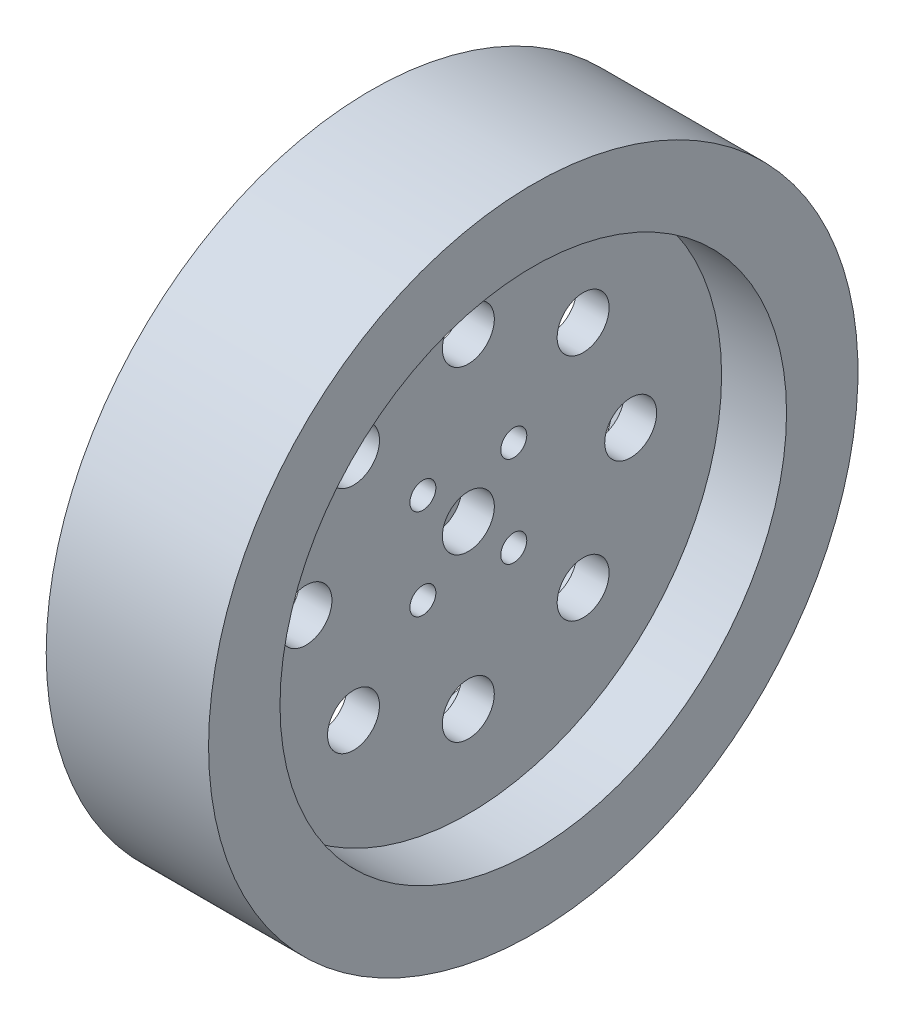
ISO-10303-21;
HEADER;
FILE_DESCRIPTION(('STEP AP214'),'2;1');
FILE_NAME('part.step','',(''),(''),'','','');
FILE_SCHEMA(('AUTOMOTIVE_DESIGN { 1 0 10303 214 1 1 1 1 }'));
ENDSEC;
DATA;
#1=APPLICATION_CONTEXT('core data for automotive mechanical design processes');
#2=APPLICATION_PROTOCOL_DEFINITION('international standard','automotive_design',2000,#1);
#3=PRODUCT_CONTEXT('',#1,'mechanical');
#4=PRODUCT('Part','Part','',(#3));
#5=PRODUCT_RELATED_PRODUCT_CATEGORY('part','',(#4));
#6=PRODUCT_DEFINITION_FORMATION('','',#4);
#7=PRODUCT_DEFINITION_CONTEXT('part definition',#1,'design');
#8=PRODUCT_DEFINITION('design','',#6,#7);
#9=PRODUCT_DEFINITION_SHAPE('','',#8);
#10=(LENGTH_UNIT() NAMED_UNIT(*) SI_UNIT(.MILLI.,.METRE.));
#11=(NAMED_UNIT(*) PLANE_ANGLE_UNIT() SI_UNIT($,.RADIAN.));
#12=(NAMED_UNIT(*) SI_UNIT($,.STERADIAN.) SOLID_ANGLE_UNIT());
#13=UNCERTAINTY_MEASURE_WITH_UNIT(LENGTH_MEASURE(1.E-05),#10,'distance_accuracy_value','');
#14=(GEOMETRIC_REPRESENTATION_CONTEXT(3) GLOBAL_UNCERTAINTY_ASSIGNED_CONTEXT((#13)) GLOBAL_UNIT_ASSIGNED_CONTEXT((#10,
#11,#12)) REPRESENTATION_CONTEXT('',''));
#15=CARTESIAN_POINT('',(0.,0.,0.));
#16=DIRECTION('',(0.,0.,1.));
#17=DIRECTION('',(1.,0.,0.));
#18=AXIS2_PLACEMENT_3D('',#15,#16,#17);
#19=CARTESIAN_POINT('',(12.5,0.,0.));
#20=DIRECTION('',(-1.,0.,0.));
#21=DIRECTION('',(0.,0.,-1.));
#22=AXIS2_PLACEMENT_3D('',#19,#20,#21);
#23=CYLINDRICAL_SURFACE('',#22,50.);
#24=CARTESIAN_POINT('',(12.5,0.,0.));
#25=DIRECTION('',(-1.,0.,0.));
#26=DIRECTION('',(0.,0.,1.));
#27=AXIS2_PLACEMENT_3D('',#24,#25,#26);
#28=CIRCLE('',#27,50.);
#29=CARTESIAN_POINT('',(12.5,0.,50.));
#30=VERTEX_POINT('',#29);
#31=EDGE_CURVE('E10',#30,#30,#28,.T.);
#32=ORIENTED_EDGE('',*,*,#31,.T.);
#33=EDGE_LOOP('',(#32));
#34=FACE_BOUND('',#33,.T.);
#35=CARTESIAN_POINT('',(-12.5,0.,0.));
#36=DIRECTION('',(-1.,0.,0.));
#37=DIRECTION('',(0.,0.,1.));
#38=AXIS2_PLACEMENT_3D('',#35,#36,#37);
#39=CIRCLE('',#38,50.);
#40=CARTESIAN_POINT('',(-12.5,0.,50.));
#41=VERTEX_POINT('',#40);
#42=EDGE_CURVE('E86',#41,#41,#39,.T.);
#43=ORIENTED_EDGE('',*,*,#42,.F.);
#44=EDGE_LOOP('',(#43));
#45=FACE_BOUND('',#44,.T.);
#46=ADVANCED_FACE('F33',(#34,#45),#23,.T.);
#47=CARTESIAN_POINT('',(12.5,0.,0.));
#48=DIRECTION('',(1.,0.,0.));
#49=DIRECTION('',(0.,0.,1.));
#50=AXIS2_PLACEMENT_3D('',#47,#48,#49);
#51=PLANE('',#50);
#52=CARTESIAN_POINT('',(12.5,0.,0.));
#53=DIRECTION('',(-1.,0.,0.));
#54=DIRECTION('',(0.,0.,1.));
#55=AXIS2_PLACEMENT_3D('',#52,#53,#54);
#56=CIRCLE('',#55,39.);
#57=CARTESIAN_POINT('',(12.5,0.,39.));
#58=VERTEX_POINT('',#57);
#59=EDGE_CURVE('E43',#58,#58,#56,.T.);
#60=ORIENTED_EDGE('',*,*,#59,.T.);
#61=EDGE_LOOP('',(#60));
#62=FACE_BOUND('',#61,.T.);
#63=ORIENTED_EDGE('',*,*,#31,.F.);
#64=EDGE_LOOP('',(#63));
#65=FACE_BOUND('',#64,.T.);
#66=ADVANCED_FACE('F161',(#62,#65),#51,.T.);
#67=CARTESIAN_POINT('',(2.5,0.,0.));
#68=DIRECTION('',(1.,0.,0.));
#69=DIRECTION('',(0.,0.,1.));
#70=AXIS2_PLACEMENT_3D('',#67,#68,#69);
#71=CYLINDRICAL_SURFACE('',#70,39.);
#72=CARTESIAN_POINT('',(2.5,0.,0.));
#73=DIRECTION('',(-1.,0.,0.));
#74=DIRECTION('',(0.,0.,1.));
#75=AXIS2_PLACEMENT_3D('',#72,#73,#74);
#76=CIRCLE('',#75,39.);
#77=CARTESIAN_POINT('',(2.5,0.,39.));
#78=VERTEX_POINT('',#77);
#79=EDGE_CURVE('E39',#78,#78,#76,.T.);
#80=ORIENTED_EDGE('',*,*,#79,.T.);
#81=EDGE_LOOP('',(#80));
#82=FACE_BOUND('',#81,.T.);
#83=ORIENTED_EDGE('',*,*,#59,.F.);
#84=EDGE_LOOP('',(#83));
#85=FACE_BOUND('',#84,.T.);
#86=ADVANCED_FACE('F165',(#82,#85),#71,.F.);
#87=CARTESIAN_POINT('',(2.5,0.,0.));
#88=DIRECTION('',(1.,0.,0.));
#89=DIRECTION('',(0.,0.,1.));
#90=AXIS2_PLACEMENT_3D('',#87,#88,#89);
#91=PLANE('',#90);
#92=CARTESIAN_POINT('',(2.5,-7.,7.));
#93=DIRECTION('',(-1.,0.,0.));
#94=DIRECTION('',(0.,0.,-1.));
#95=AXIS2_PLACEMENT_3D('',#92,#93,#94);
#96=CIRCLE('',#95,2.);
#97=CARTESIAN_POINT('',(2.5,-7.,5.));
#98=VERTEX_POINT('',#97);
#99=EDGE_CURVE('E82',#98,#98,#96,.T.);
#100=ORIENTED_EDGE('',*,*,#99,.T.);
#101=EDGE_LOOP('',(#100));
#102=FACE_BOUND('',#101,.T.);
#103=CARTESIAN_POINT('',(2.5,7.00000000000007,6.99999999999993));
#104=DIRECTION('',(-1.,0.,0.));
#105=DIRECTION('',(0.,-1.,0.));
#106=AXIS2_PLACEMENT_3D('',#103,#104,#105);
#107=CIRCLE('',#106,2.);
#108=CARTESIAN_POINT('',(2.5,5.00000000000007,6.99999999999995));
#109=VERTEX_POINT('',#108);
#110=EDGE_CURVE('E83',#109,#109,#107,.T.);
#111=ORIENTED_EDGE('',*,*,#110,.T.);
#112=EDGE_LOOP('',(#111));
#113=FACE_BOUND('',#112,.T.);
#114=CARTESIAN_POINT('',(2.5,-7.00000000000002,-6.99999999999998));
#115=DIRECTION('',(-1.,0.,0.));
#116=DIRECTION('',(0.,1.,0.));
#117=AXIS2_PLACEMENT_3D('',#114,#115,#116);
#118=CIRCLE('',#117,2.);
#119=CARTESIAN_POINT('',(2.5,-5.00000000000002,-6.99999999999998));
#120=VERTEX_POINT('',#119);
#121=EDGE_CURVE('E79',#120,#120,#118,.T.);
#122=ORIENTED_EDGE('',*,*,#121,.T.);
#123=EDGE_LOOP('',(#122));
#124=FACE_BOUND('',#123,.T.);
#125=CARTESIAN_POINT('',(2.5,7.,-7.));
#126=DIRECTION('',(-1.,0.,0.));
#127=DIRECTION('',(0.,0.,1.));
#128=AXIS2_PLACEMENT_3D('',#125,#126,#127);
#129=CIRCLE('',#128,2.);
#130=CARTESIAN_POINT('',(2.5,7.,-5.));
#131=VERTEX_POINT('',#130);
#132=EDGE_CURVE('E76',#131,#131,#129,.T.);
#133=ORIENTED_EDGE('',*,*,#132,.T.);
#134=EDGE_LOOP('',(#133));
#135=FACE_BOUND('',#134,.T.);
#136=CARTESIAN_POINT('',(2.5,0.,0.));
#137=DIRECTION('',(-1.,0.,0.));
#138=DIRECTION('',(0.,0.,1.));
#139=AXIS2_PLACEMENT_3D('',#136,#137,#138);
#140=CIRCLE('',#139,4.);
#141=CARTESIAN_POINT('',(2.5,0.,4.));
#142=VERTEX_POINT('',#141);
#143=EDGE_CURVE('E60',#142,#142,#140,.T.);
#144=ORIENTED_EDGE('',*,*,#143,.T.);
#145=EDGE_LOOP('',(#144));
#146=FACE_BOUND('',#145,.T.);
#147=CARTESIAN_POINT('',(2.5,0.,-25.));
#148=DIRECTION('',(-1.,0.,0.));
#149=DIRECTION('',(0.,1.,0.));
#150=AXIS2_PLACEMENT_3D('',#147,#148,#149);
#151=CIRCLE('',#150,4.);
#152=CARTESIAN_POINT('',(2.5,3.99999999999991,-25.));
#153=VERTEX_POINT('',#152);
#154=EDGE_CURVE('E55',#153,#153,#151,.T.);
#155=ORIENTED_EDGE('',*,*,#154,.T.);
#156=EDGE_LOOP('',(#155));
#157=FACE_BOUND('',#156,.T.);
#158=CARTESIAN_POINT('',(2.5,-17.6776695296638,-17.6776695296636));
#159=DIRECTION('',(-1.,0.,0.));
#160=DIRECTION('',(0.,0.707106781186544,-0.707106781186551));
#161=AXIS2_PLACEMENT_3D('',#158,#159,#160);
#162=CIRCLE('',#161,4.);
#163=CARTESIAN_POINT('',(2.5,-14.8492424049176,-20.5060966544098));
#164=VERTEX_POINT('',#163);
#165=EDGE_CURVE('E69',#164,#164,#162,.T.);
#166=ORIENTED_EDGE('',*,*,#165,.T.);
#167=EDGE_LOOP('',(#166));
#168=FACE_BOUND('',#167,.T.);
#169=CARTESIAN_POINT('',(2.5,-25.,0.));
#170=DIRECTION('',(-1.,0.,0.));
#171=DIRECTION('',(0.,0.,-1.));
#172=AXIS2_PLACEMENT_3D('',#169,#170,#171);
#173=CIRCLE('',#172,4.);
#174=CARTESIAN_POINT('',(2.5,-25.,-4.));
#175=VERTEX_POINT('',#174);
#176=EDGE_CURVE('E66',#175,#175,#173,.T.);
#177=ORIENTED_EDGE('',*,*,#176,.T.);
#178=EDGE_LOOP('',(#177));
#179=FACE_BOUND('',#178,.T.);
#180=CARTESIAN_POINT('',(2.5,-17.6776695296635,17.6776695296638));
#181=DIRECTION('',(-1.,0.,0.));
#182=DIRECTION('',(0.,-0.707106781186554,-0.707106781186541));
#183=AXIS2_PLACEMENT_3D('',#180,#181,#182);
#184=CIRCLE('',#183,4.);
#185=CARTESIAN_POINT('',(2.5,-20.5060966544097,14.8492424049177));
#186=VERTEX_POINT('',#185);
#187=EDGE_CURVE('E63',#186,#186,#184,.T.);
#188=ORIENTED_EDGE('',*,*,#187,.T.);
#189=EDGE_LOOP('',(#188));
#190=FACE_BOUND('',#189,.T.);
#191=CARTESIAN_POINT('',(2.5,2.61861100413235E-13,25.));
#192=DIRECTION('',(-1.,0.,0.));
#193=DIRECTION('',(0.,-1.,0.));
#194=AXIS2_PLACEMENT_3D('',#191,#192,#193);
#195=CIRCLE('',#194,4.);
#196=CARTESIAN_POINT('',(2.5,-3.99999999999974,25.));
#197=VERTEX_POINT('',#196);
#198=EDGE_CURVE('E59',#197,#197,#195,.T.);
#199=ORIENTED_EDGE('',*,*,#198,.T.);
#200=EDGE_LOOP('',(#199));
#201=FACE_BOUND('',#200,.T.);
#202=CARTESIAN_POINT('',(2.5,17.6776695296639,17.6776695296635));
#203=DIRECTION('',(-1.,0.,0.));
#204=DIRECTION('',(0.,-0.707106781186539,0.707106781186556));
#205=AXIS2_PLACEMENT_3D('',#202,#203,#204);
#206=CIRCLE('',#205,4.);
#207=CARTESIAN_POINT('',(2.5,14.8492424049177,20.5060966544097));
#208=VERTEX_POINT('',#207);
#209=EDGE_CURVE('E56',#208,#208,#206,.T.);
#210=ORIENTED_EDGE('',*,*,#209,.T.);
#211=EDGE_LOOP('',(#210));
#212=FACE_BOUND('',#211,.T.);
#213=CARTESIAN_POINT('',(2.5,17.6776695296637,-17.6776695296637));
#214=DIRECTION('',(-1.,0.,0.));
#215=DIRECTION('',(0.,0.707106781186549,0.707106781186546));
#216=AXIS2_PLACEMENT_3D('',#213,#214,#215);
#217=CIRCLE('',#216,4.);
#218=CARTESIAN_POINT('',(2.5,20.5060966544099,-14.8492424049175));
#219=VERTEX_POINT('',#218);
#220=EDGE_CURVE('E52',#219,#219,#217,.T.);
#221=ORIENTED_EDGE('',*,*,#220,.T.);
#222=EDGE_LOOP('',(#221));
#223=FACE_BOUND('',#222,.T.);
#224=CARTESIAN_POINT('',(2.5,25.,0.));
#225=DIRECTION('',(-1.,0.,0.));
#226=DIRECTION('',(0.,0.,1.));
#227=AXIS2_PLACEMENT_3D('',#224,#225,#226);
#228=CIRCLE('',#227,4.);
#229=CARTESIAN_POINT('',(2.5,25.,4.));
#230=VERTEX_POINT('',#229);
#231=EDGE_CURVE('E48',#230,#230,#228,.T.);
#232=ORIENTED_EDGE('',*,*,#231,.T.);
#233=EDGE_LOOP('',(#232));
#234=FACE_BOUND('',#233,.T.);
#235=ORIENTED_EDGE('',*,*,#79,.F.);
#236=EDGE_LOOP('',(#235));
#237=FACE_BOUND('',#236,.T.);
#238=ADVANCED_FACE('F232',(#102,#113,#124,#135,#146,#157,#168,#179,#190,#201,#212,#223,#234,
#237),#91,.T.);
#239=CARTESIAN_POINT('',(0.,25.,0.));
#240=DIRECTION('',(1.,0.,0.));
#241=DIRECTION('',(0.,0.,1.));
#242=AXIS2_PLACEMENT_3D('',#239,#240,#241);
#243=CYLINDRICAL_SURFACE('',#242,4.);
#244=ORIENTED_EDGE('',*,*,#231,.F.);
#245=EDGE_LOOP('',(#244));
#246=FACE_BOUND('',#245,.T.);
#247=CARTESIAN_POINT('',(-2.5,25.,0.));
#248=DIRECTION('',(-1.,0.,0.));
#249=DIRECTION('',(0.,0.,1.));
#250=AXIS2_PLACEMENT_3D('',#247,#248,#249);
#251=CIRCLE('',#250,4.);
#252=CARTESIAN_POINT('',(-2.5,25.,4.));
#253=VERTEX_POINT('',#252);
#254=EDGE_CURVE('E95',#253,#253,#251,.T.);
#255=ORIENTED_EDGE('',*,*,#254,.T.);
#256=EDGE_LOOP('',(#255));
#257=FACE_BOUND('',#256,.T.);
#258=ADVANCED_FACE('F228',(#246,#257),#243,.F.);
#259=CARTESIAN_POINT('',(0.,17.6776695296637,-17.6776695296637));
#260=DIRECTION('',(1.,0.,0.));
#261=DIRECTION('',(0.,0.,1.));
#262=AXIS2_PLACEMENT_3D('',#259,#260,#261);
#263=CYLINDRICAL_SURFACE('',#262,4.);
#264=ORIENTED_EDGE('',*,*,#220,.F.);
#265=EDGE_LOOP('',(#264));
#266=FACE_BOUND('',#265,.T.);
#267=CARTESIAN_POINT('',(-2.5,17.6776695296637,-17.6776695296637));
#268=DIRECTION('',(-1.,0.,0.));
#269=DIRECTION('',(0.,0.707106781186549,0.707106781186546));
#270=AXIS2_PLACEMENT_3D('',#267,#268,#269);
#271=CIRCLE('',#270,4.);
#272=CARTESIAN_POINT('',(-2.5,20.5060966544099,-14.8492424049175));
#273=VERTEX_POINT('',#272);
#274=EDGE_CURVE('E100',#273,#273,#271,.T.);
#275=ORIENTED_EDGE('',*,*,#274,.T.);
#276=EDGE_LOOP('',(#275));
#277=FACE_BOUND('',#276,.T.);
#278=ADVANCED_FACE('F224',(#266,#277),#263,.F.);
#279=CARTESIAN_POINT('',(0.,17.6776695296639,17.6776695296635));
#280=DIRECTION('',(1.,0.,0.));
#281=DIRECTION('',(0.,0.,1.));
#282=AXIS2_PLACEMENT_3D('',#279,#280,#281);
#283=CYLINDRICAL_SURFACE('',#282,4.);
#284=ORIENTED_EDGE('',*,*,#209,.F.);
#285=EDGE_LOOP('',(#284));
#286=FACE_BOUND('',#285,.T.);
#287=CARTESIAN_POINT('',(-2.5,17.6776695296639,17.6776695296635));
#288=DIRECTION('',(-1.,0.,0.));
#289=DIRECTION('',(0.,-0.707106781186539,0.707106781186556));
#290=AXIS2_PLACEMENT_3D('',#287,#288,#289);
#291=CIRCLE('',#290,4.);
#292=CARTESIAN_POINT('',(-2.5,14.8492424049177,20.5060966544097));
#293=VERTEX_POINT('',#292);
#294=EDGE_CURVE('E101',#293,#293,#291,.T.);
#295=ORIENTED_EDGE('',*,*,#294,.T.);
#296=EDGE_LOOP('',(#295));
#297=FACE_BOUND('',#296,.T.);
#298=ADVANCED_FACE('F220',(#286,#297),#283,.F.);
#299=CARTESIAN_POINT('',(0.,2.61861100413235E-13,25.));
#300=DIRECTION('',(1.,0.,0.));
#301=DIRECTION('',(0.,0.,1.));
#302=AXIS2_PLACEMENT_3D('',#299,#300,#301);
#303=CYLINDRICAL_SURFACE('',#302,4.);
#304=ORIENTED_EDGE('',*,*,#198,.F.);
#305=EDGE_LOOP('',(#304));
#306=FACE_BOUND('',#305,.T.);
#307=CARTESIAN_POINT('',(-2.5,2.61861100413235E-13,25.));
#308=DIRECTION('',(-1.,0.,0.));
#309=DIRECTION('',(0.,-1.,0.));
#310=AXIS2_PLACEMENT_3D('',#307,#308,#309);
#311=CIRCLE('',#310,4.);
#312=CARTESIAN_POINT('',(-2.5,-3.99999999999974,25.));
#313=VERTEX_POINT('',#312);
#314=EDGE_CURVE('E104',#313,#313,#311,.T.);
#315=ORIENTED_EDGE('',*,*,#314,.T.);
#316=EDGE_LOOP('',(#315));
#317=FACE_BOUND('',#316,.T.);
#318=ADVANCED_FACE('F216',(#306,#317),#303,.F.);
#319=CARTESIAN_POINT('',(0.,-17.6776695296635,17.6776695296638));
#320=DIRECTION('',(1.,0.,0.));
#321=DIRECTION('',(0.,0.,1.));
#322=AXIS2_PLACEMENT_3D('',#319,#320,#321);
#323=CYLINDRICAL_SURFACE('',#322,4.);
#324=ORIENTED_EDGE('',*,*,#187,.F.);
#325=EDGE_LOOP('',(#324));
#326=FACE_BOUND('',#325,.T.);
#327=CARTESIAN_POINT('',(-2.5,-17.6776695296635,17.6776695296638));
#328=DIRECTION('',(-1.,0.,0.));
#329=DIRECTION('',(0.,-0.707106781186554,-0.707106781186541));
#330=AXIS2_PLACEMENT_3D('',#327,#328,#329);
#331=CIRCLE('',#330,4.);
#332=CARTESIAN_POINT('',(-2.5,-20.5060966544097,14.8492424049177));
#333=VERTEX_POINT('',#332);
#334=EDGE_CURVE('E108',#333,#333,#331,.T.);
#335=ORIENTED_EDGE('',*,*,#334,.T.);
#336=EDGE_LOOP('',(#335));
#337=FACE_BOUND('',#336,.T.);
#338=ADVANCED_FACE('F212',(#326,#337),#323,.F.);
#339=CARTESIAN_POINT('',(0.,-25.,0.));
#340=DIRECTION('',(1.,0.,0.));
#341=DIRECTION('',(0.,0.,1.));
#342=AXIS2_PLACEMENT_3D('',#339,#340,#341);
#343=CYLINDRICAL_SURFACE('',#342,4.);
#344=ORIENTED_EDGE('',*,*,#176,.F.);
#345=EDGE_LOOP('',(#344));
#346=FACE_BOUND('',#345,.T.);
#347=CARTESIAN_POINT('',(-2.5,-25.,0.));
#348=DIRECTION('',(-1.,0.,0.));
#349=DIRECTION('',(0.,0.,-1.));
#350=AXIS2_PLACEMENT_3D('',#347,#348,#349);
#351=CIRCLE('',#350,4.);
#352=CARTESIAN_POINT('',(-2.5,-25.,-4.));
#353=VERTEX_POINT('',#352);
#354=EDGE_CURVE('E111',#353,#353,#351,.T.);
#355=ORIENTED_EDGE('',*,*,#354,.T.);
#356=EDGE_LOOP('',(#355));
#357=FACE_BOUND('',#356,.T.);
#358=ADVANCED_FACE('F208',(#346,#357),#343,.F.);
#359=CARTESIAN_POINT('',(0.,-17.6776695296638,-17.6776695296636));
#360=DIRECTION('',(1.,0.,0.));
#361=DIRECTION('',(0.,0.,1.));
#362=AXIS2_PLACEMENT_3D('',#359,#360,#361);
#363=CYLINDRICAL_SURFACE('',#362,4.);
#364=ORIENTED_EDGE('',*,*,#165,.F.);
#365=EDGE_LOOP('',(#364));
#366=FACE_BOUND('',#365,.T.);
#367=CARTESIAN_POINT('',(-2.5,-17.6776695296638,-17.6776695296636));
#368=DIRECTION('',(-1.,0.,0.));
#369=DIRECTION('',(0.,0.707106781186544,-0.707106781186551));
#370=AXIS2_PLACEMENT_3D('',#367,#368,#369);
#371=CIRCLE('',#370,4.);
#372=CARTESIAN_POINT('',(-2.5,-14.8492424049176,-20.5060966544098));
#373=VERTEX_POINT('',#372);
#374=EDGE_CURVE('E114',#373,#373,#371,.T.);
#375=ORIENTED_EDGE('',*,*,#374,.T.);
#376=EDGE_LOOP('',(#375));
#377=FACE_BOUND('',#376,.T.);
#378=ADVANCED_FACE('F204',(#366,#377),#363,.F.);
#379=CARTESIAN_POINT('',(0.,0.,-25.));
#380=DIRECTION('',(1.,0.,0.));
#381=DIRECTION('',(0.,0.,1.));
#382=AXIS2_PLACEMENT_3D('',#379,#380,#381);
#383=CYLINDRICAL_SURFACE('',#382,4.);
#384=ORIENTED_EDGE('',*,*,#154,.F.);
#385=EDGE_LOOP('',(#384));
#386=FACE_BOUND('',#385,.T.);
#387=CARTESIAN_POINT('',(-2.5,0.,-25.));
#388=DIRECTION('',(-1.,0.,0.));
#389=DIRECTION('',(0.,1.,0.));
#390=AXIS2_PLACEMENT_3D('',#387,#388,#389);
#391=CIRCLE('',#390,4.);
#392=CARTESIAN_POINT('',(-2.5,3.99999999999991,-25.));
#393=VERTEX_POINT('',#392);
#394=EDGE_CURVE('E117',#393,#393,#391,.T.);
#395=ORIENTED_EDGE('',*,*,#394,.T.);
#396=EDGE_LOOP('',(#395));
#397=FACE_BOUND('',#396,.T.);
#398=ADVANCED_FACE('F200',(#386,#397),#383,.F.);
#399=CARTESIAN_POINT('',(0.,0.,0.));
#400=DIRECTION('',(1.,0.,0.));
#401=DIRECTION('',(0.,0.,1.));
#402=AXIS2_PLACEMENT_3D('',#399,#400,#401);
#403=CYLINDRICAL_SURFACE('',#402,4.);
#404=ORIENTED_EDGE('',*,*,#143,.F.);
#405=EDGE_LOOP('',(#404));
#406=FACE_BOUND('',#405,.T.);
#407=CARTESIAN_POINT('',(-2.5,0.,0.));
#408=DIRECTION('',(-1.,0.,0.));
#409=DIRECTION('',(0.,0.,1.));
#410=AXIS2_PLACEMENT_3D('',#407,#408,#409);
#411=CIRCLE('',#410,4.);
#412=CARTESIAN_POINT('',(-2.5,0.,4.));
#413=VERTEX_POINT('',#412);
#414=EDGE_CURVE('E105',#413,#413,#411,.T.);
#415=ORIENTED_EDGE('',*,*,#414,.T.);
#416=EDGE_LOOP('',(#415));
#417=FACE_BOUND('',#416,.T.);
#418=ADVANCED_FACE('F196',(#406,#417),#403,.F.);
#419=CARTESIAN_POINT('',(0.,7.,-7.));
#420=DIRECTION('',(1.,0.,0.));
#421=DIRECTION('',(0.,0.,1.));
#422=AXIS2_PLACEMENT_3D('',#419,#420,#421);
#423=CYLINDRICAL_SURFACE('',#422,2.);
#424=ORIENTED_EDGE('',*,*,#132,.F.);
#425=EDGE_LOOP('',(#424));
#426=FACE_BOUND('',#425,.T.);
#427=CARTESIAN_POINT('',(-2.5,7.,-7.));
#428=DIRECTION('',(-1.,0.,0.));
#429=DIRECTION('',(0.,0.,1.));
#430=AXIS2_PLACEMENT_3D('',#427,#428,#429);
#431=CIRCLE('',#430,2.);
#432=CARTESIAN_POINT('',(-2.5,7.,-5.));
#433=VERTEX_POINT('',#432);
#434=EDGE_CURVE('E124',#433,#433,#431,.T.);
#435=ORIENTED_EDGE('',*,*,#434,.T.);
#436=EDGE_LOOP('',(#435));
#437=FACE_BOUND('',#436,.T.);
#438=ADVANCED_FACE('F192',(#426,#437),#423,.F.);
#439=CARTESIAN_POINT('',(0.,-7.00000000000002,-6.99999999999998));
#440=DIRECTION('',(1.,0.,0.));
#441=DIRECTION('',(0.,0.,1.));
#442=AXIS2_PLACEMENT_3D('',#439,#440,#441);
#443=CYLINDRICAL_SURFACE('',#442,2.);
#444=ORIENTED_EDGE('',*,*,#121,.F.);
#445=EDGE_LOOP('',(#444));
#446=FACE_BOUND('',#445,.T.);
#447=CARTESIAN_POINT('',(-2.5,-7.00000000000002,-6.99999999999998));
#448=DIRECTION('',(-1.,0.,0.));
#449=DIRECTION('',(0.,1.,0.));
#450=AXIS2_PLACEMENT_3D('',#447,#448,#449);
#451=CIRCLE('',#450,2.);
#452=CARTESIAN_POINT('',(-2.5,-5.00000000000002,-6.99999999999998));
#453=VERTEX_POINT('',#452);
#454=EDGE_CURVE('E127',#453,#453,#451,.T.);
#455=ORIENTED_EDGE('',*,*,#454,.T.);
#456=EDGE_LOOP('',(#455));
#457=FACE_BOUND('',#456,.T.);
#458=ADVANCED_FACE('F188',(#446,#457),#443,.F.);
#459=CARTESIAN_POINT('',(0.,7.00000000000007,6.99999999999993));
#460=DIRECTION('',(1.,0.,0.));
#461=DIRECTION('',(0.,0.,1.));
#462=AXIS2_PLACEMENT_3D('',#459,#460,#461);
#463=CYLINDRICAL_SURFACE('',#462,2.);
#464=ORIENTED_EDGE('',*,*,#110,.F.);
#465=EDGE_LOOP('',(#464));
#466=FACE_BOUND('',#465,.T.);
#467=CARTESIAN_POINT('',(-2.5,7.00000000000007,6.99999999999993));
#468=DIRECTION('',(-1.,0.,0.));
#469=DIRECTION('',(0.,-1.,0.));
#470=AXIS2_PLACEMENT_3D('',#467,#468,#469);
#471=CIRCLE('',#470,2.);
#472=CARTESIAN_POINT('',(-2.5,5.00000000000007,6.99999999999995));
#473=VERTEX_POINT('',#472);
#474=EDGE_CURVE('E128',#473,#473,#471,.T.);
#475=ORIENTED_EDGE('',*,*,#474,.T.);
#476=EDGE_LOOP('',(#475));
#477=FACE_BOUND('',#476,.T.);
#478=ADVANCED_FACE('F181',(#466,#477),#463,.F.);
#479=CARTESIAN_POINT('',(0.,-7.,7.));
#480=DIRECTION('',(1.,0.,0.));
#481=DIRECTION('',(0.,0.,1.));
#482=AXIS2_PLACEMENT_3D('',#479,#480,#481);
#483=CYLINDRICAL_SURFACE('',#482,2.);
#484=ORIENTED_EDGE('',*,*,#99,.F.);
#485=EDGE_LOOP('',(#484));
#486=FACE_BOUND('',#485,.T.);
#487=CARTESIAN_POINT('',(-2.5,-7.,7.));
#488=DIRECTION('',(-1.,0.,0.));
#489=DIRECTION('',(0.,0.,-1.));
#490=AXIS2_PLACEMENT_3D('',#487,#488,#489);
#491=CIRCLE('',#490,2.);
#492=CARTESIAN_POINT('',(-2.5,-7.,5.));
#493=VERTEX_POINT('',#492);
#494=EDGE_CURVE('E131',#493,#493,#491,.T.);
#495=ORIENTED_EDGE('',*,*,#494,.T.);
#496=EDGE_LOOP('',(#495));
#497=FACE_BOUND('',#496,.T.);
#498=ADVANCED_FACE('F172',(#486,#497),#483,.F.);
#499=CARTESIAN_POINT('',(-12.5,0.,0.));
#500=DIRECTION('',(-1.,0.,0.));
#501=DIRECTION('',(0.,0.,1.));
#502=AXIS2_PLACEMENT_3D('',#499,#500,#501);
#503=PLANE('',#502);
#504=CARTESIAN_POINT('',(-12.5,0.,0.));
#505=DIRECTION('',(-1.,0.,0.));
#506=DIRECTION('',(0.,0.,1.));
#507=AXIS2_PLACEMENT_3D('',#504,#505,#506);
#508=CIRCLE('',#507,39.);
#509=CARTESIAN_POINT('',(-12.5,0.,39.));
#510=VERTEX_POINT('',#509);
#511=EDGE_CURVE('E92',#510,#510,#508,.T.);
#512=ORIENTED_EDGE('',*,*,#511,.F.);
#513=EDGE_LOOP('',(#512));
#514=FACE_BOUND('',#513,.T.);
#515=ORIENTED_EDGE('',*,*,#42,.T.);
#516=EDGE_LOOP('',(#515));
#517=FACE_BOUND('',#516,.T.);
#518=ADVANCED_FACE('F170',(#514,#517),#503,.T.);
#519=CARTESIAN_POINT('',(-2.5,0.,0.));
#520=DIRECTION('',(-1.,0.,0.));
#521=DIRECTION('',(0.,0.,-1.));
#522=AXIS2_PLACEMENT_3D('',#519,#520,#521);
#523=CYLINDRICAL_SURFACE('',#522,39.);
#524=CARTESIAN_POINT('',(-2.5,0.,0.));
#525=DIRECTION('',(-1.,0.,0.));
#526=DIRECTION('',(0.,0.,1.));
#527=AXIS2_PLACEMENT_3D('',#524,#525,#526);
#528=CIRCLE('',#527,39.);
#529=CARTESIAN_POINT('',(-2.5,0.,39.));
#530=VERTEX_POINT('',#529);
#531=EDGE_CURVE('E91',#530,#530,#528,.T.);
#532=ORIENTED_EDGE('',*,*,#531,.F.);
#533=EDGE_LOOP('',(#532));
#534=FACE_BOUND('',#533,.T.);
#535=ORIENTED_EDGE('',*,*,#511,.T.);
#536=EDGE_LOOP('',(#535));
#537=FACE_BOUND('',#536,.T.);
#538=ADVANCED_FACE('F156',(#534,#537),#523,.F.);
#539=CARTESIAN_POINT('',(-2.5,0.,0.));
#540=DIRECTION('',(-1.,0.,0.));
#541=DIRECTION('',(0.,0.,1.));
#542=AXIS2_PLACEMENT_3D('',#539,#540,#541);
#543=PLANE('',#542);
#544=CARTESIAN_POINT('',(-2.5,0.,0.));
#545=DIRECTION('',(1.,0.,0.));
#546=DIRECTION('',(0.,0.,-1.));
#547=AXIS2_PLACEMENT_3D('',#544,#545,#546);
#548=CIRCLE('',#547,12.5);
#549=CARTESIAN_POINT('',(-2.5,0.,-12.5));
#550=VERTEX_POINT('',#549);
#551=EDGE_CURVE('E137',#550,#550,#548,.T.);
#552=ORIENTED_EDGE('',*,*,#551,.T.);
#553=EDGE_LOOP('',(#552));
#554=FACE_BOUND('',#553,.T.);
#555=ORIENTED_EDGE('',*,*,#274,.F.);
#556=EDGE_LOOP('',(#555));
#557=FACE_BOUND('',#556,.T.);
#558=ORIENTED_EDGE('',*,*,#394,.F.);
#559=EDGE_LOOP('',(#558));
#560=FACE_BOUND('',#559,.T.);
#561=ORIENTED_EDGE('',*,*,#374,.F.);
#562=EDGE_LOOP('',(#561));
#563=FACE_BOUND('',#562,.T.);
#564=ORIENTED_EDGE('',*,*,#354,.F.);
#565=EDGE_LOOP('',(#564));
#566=FACE_BOUND('',#565,.T.);
#567=ORIENTED_EDGE('',*,*,#334,.F.);
#568=EDGE_LOOP('',(#567));
#569=FACE_BOUND('',#568,.T.);
#570=ORIENTED_EDGE('',*,*,#314,.F.);
#571=EDGE_LOOP('',(#570));
#572=FACE_BOUND('',#571,.T.);
#573=ORIENTED_EDGE('',*,*,#294,.F.);
#574=EDGE_LOOP('',(#573));
#575=FACE_BOUND('',#574,.T.);
#576=ORIENTED_EDGE('',*,*,#254,.F.);
#577=EDGE_LOOP('',(#576));
#578=FACE_BOUND('',#577,.T.);
#579=ORIENTED_EDGE('',*,*,#531,.T.);
#580=EDGE_LOOP('',(#579));
#581=FACE_BOUND('',#580,.T.);
#582=ADVANCED_FACE('F148',(#554,#557,#560,#563,#566,#569,#572,#575,#578,#581),#543,.T.);
#583=CARTESIAN_POINT('',(-10.5,0.,0.));
#584=DIRECTION('',(-1.,0.,0.));
#585=DIRECTION('',(0.,0.,-1.));
#586=AXIS2_PLACEMENT_3D('',#583,#584,#585);
#587=PLANE('',#586);
#588=CARTESIAN_POINT('',(-10.5,0.,0.));
#589=DIRECTION('',(1.,0.,0.));
#590=DIRECTION('',(0.,0.,-1.));
#591=AXIS2_PLACEMENT_3D('',#588,#589,#590);
#592=CIRCLE('',#591,12.5);
#593=CARTESIAN_POINT('',(-10.5,0.,-12.5));
#594=VERTEX_POINT('',#593);
#595=EDGE_CURVE('E132',#594,#594,#592,.T.);
#596=ORIENTED_EDGE('',*,*,#595,.F.);
#597=EDGE_LOOP('',(#596));
#598=FACE_BOUND('',#597,.T.);
#599=ADVANCED_FACE('F146',(#598),#587,.T.);
#600=CARTESIAN_POINT('',(-10.5,0.,0.));
#601=DIRECTION('',(1.,0.,0.));
#602=DIRECTION('',(0.,0.,1.));
#603=AXIS2_PLACEMENT_3D('',#600,#601,#602);
#604=CYLINDRICAL_SURFACE('',#603,12.5);
#605=ORIENTED_EDGE('',*,*,#595,.T.);
#606=EDGE_LOOP('',(#605));
#607=FACE_BOUND('',#606,.T.);
#608=ORIENTED_EDGE('',*,*,#551,.F.);
#609=EDGE_LOOP('',(#608));
#610=FACE_BOUND('',#609,.T.);
#611=ADVANCED_FACE('F143',(#607,#610),#604,.T.);
#612=CARTESIAN_POINT('',(-2.5,0.,0.));
#613=DIRECTION('',(-1.,0.,0.));
#614=DIRECTION('',(0.,0.,-1.));
#615=AXIS2_PLACEMENT_3D('',#612,#613,#614);
#616=PLANE('',#615);
#617=ORIENTED_EDGE('',*,*,#494,.F.);
#618=EDGE_LOOP('',(#617));
#619=FACE_BOUND('',#618,.T.);
#620=ADVANCED_FACE('F154',(#619),#616,.F.);
#621=ORIENTED_EDGE('',*,*,#474,.F.);
#622=EDGE_LOOP('',(#621));
#623=FACE_BOUND('',#622,.T.);
#624=ADVANCED_FACE('F337',(#623),#616,.F.);
#625=ORIENTED_EDGE('',*,*,#454,.F.);
#626=EDGE_LOOP('',(#625));
#627=FACE_BOUND('',#626,.T.);
#628=ADVANCED_FACE('F347',(#627),#616,.F.);
#629=ORIENTED_EDGE('',*,*,#434,.F.);
#630=EDGE_LOOP('',(#629));
#631=FACE_BOUND('',#630,.T.);
#632=ADVANCED_FACE('F356',(#631),#616,.F.);
#633=ORIENTED_EDGE('',*,*,#414,.F.);
#634=EDGE_LOOP('',(#633));
#635=FACE_BOUND('',#634,.T.);
#636=ADVANCED_FACE('F339',(#635),#616,.F.);
#637=CLOSED_SHELL('',(#46,#66,#86,#238,#258,#278,#298,#318,#338,#358,#378,#398,#418,#438,#458,
#478,#498,#518,#538,#582,#599,#611,#620,#624,#628,#632,#636));
#638=MANIFOLD_SOLID_BREP('B2',#637);
#639=ADVANCED_BREP_SHAPE_REPRESENTATION('',(#18,#638),#14);
#640=SHAPE_DEFINITION_REPRESENTATION(#9,#639);
ENDSEC;
END-ISO-10303-21;
